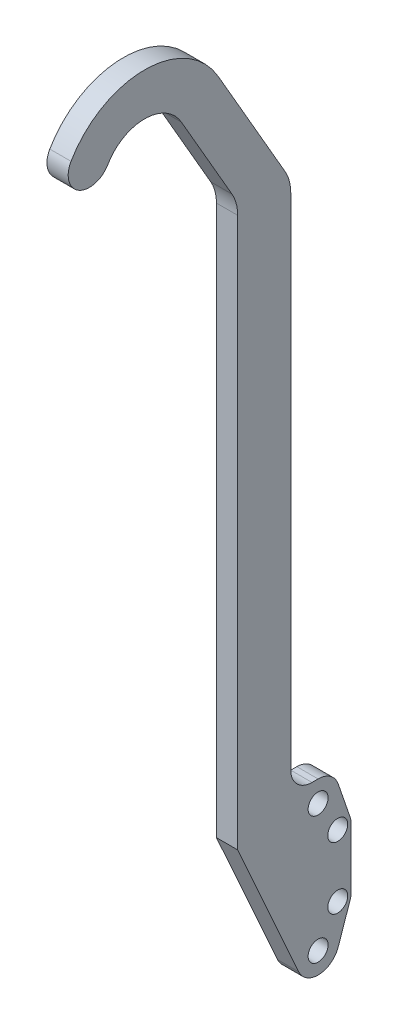
ISO-10303-21;
HEADER;
FILE_DESCRIPTION(('STEP AP214'),'2;1');
FILE_NAME('part.step','',(''),(''),'','','');
FILE_SCHEMA(('AUTOMOTIVE_DESIGN { 1 0 10303 214 1 1 1 1 }'));
ENDSEC;
DATA;
#1=APPLICATION_CONTEXT('core data for automotive mechanical design processes');
#2=APPLICATION_PROTOCOL_DEFINITION('international standard','automotive_design',2000,#1);
#3=PRODUCT_CONTEXT('',#1,'mechanical');
#4=PRODUCT('Part','Part','',(#3));
#5=PRODUCT_RELATED_PRODUCT_CATEGORY('part','',(#4));
#6=PRODUCT_DEFINITION_FORMATION('','',#4);
#7=PRODUCT_DEFINITION_CONTEXT('part definition',#1,'design');
#8=PRODUCT_DEFINITION('design','',#6,#7);
#9=PRODUCT_DEFINITION_SHAPE('','',#8);
#10=(LENGTH_UNIT() NAMED_UNIT(*) SI_UNIT(.MILLI.,.METRE.));
#11=(NAMED_UNIT(*) PLANE_ANGLE_UNIT() SI_UNIT($,.RADIAN.));
#12=(NAMED_UNIT(*) SI_UNIT($,.STERADIAN.) SOLID_ANGLE_UNIT());
#13=UNCERTAINTY_MEASURE_WITH_UNIT(LENGTH_MEASURE(1.E-05),#10,'distance_accuracy_value','');
#14=(GEOMETRIC_REPRESENTATION_CONTEXT(3) GLOBAL_UNCERTAINTY_ASSIGNED_CONTEXT((#13)) GLOBAL_UNIT_ASSIGNED_CONTEXT((#10,
#11,#12)) REPRESENTATION_CONTEXT('',''));
#15=CARTESIAN_POINT('',(0.,0.,0.));
#16=DIRECTION('',(0.,0.,1.));
#17=DIRECTION('',(1.,0.,0.));
#18=AXIS2_PLACEMENT_3D('',#15,#16,#17);
#19=CARTESIAN_POINT('',(3.175,19.05,26.9875));
#20=DIRECTION('',(0.,0.,-1.));
#21=DIRECTION('',(-1.,0.,0.));
#22=AXIS2_PLACEMENT_3D('',#19,#20,#21);
#23=PLANE('',#22);
#24=DIRECTION('',(0.,-1.,0.));
#25=VECTOR('',#24,1.);
#26=CARTESIAN_POINT('',(3.175,19.05,26.9875));
#27=LINE('',#26,#25);
#28=CARTESIAN_POINT('',(3.175,183.35625,26.9875));
#29=VERTEX_POINT('',#28);
#30=CARTESIAN_POINT('',(3.175,19.05,26.9875));
#31=VERTEX_POINT('',#30);
#32=EDGE_CURVE('E169',#29,#31,#27,.T.);
#33=ORIENTED_EDGE('',*,*,#32,.F.);
#34=DIRECTION('',(-1.,0.,0.));
#35=VECTOR('',#34,1.);
#36=CARTESIAN_POINT('',(-3.175,183.35625,26.9875));
#37=LINE('',#36,#35);
#38=CARTESIAN_POINT('',(-3.175,183.35625,26.9875));
#39=VERTEX_POINT('',#38);
#40=EDGE_CURVE('E211',#29,#39,#37,.T.);
#41=ORIENTED_EDGE('',*,*,#40,.T.);
#42=DIRECTION('',(0.,-1.,0.));
#43=VECTOR('',#42,1.);
#44=CARTESIAN_POINT('',(-3.175,19.05,26.9875));
#45=LINE('',#44,#43);
#46=CARTESIAN_POINT('',(-3.175,19.05,26.9875));
#47=VERTEX_POINT('',#46);
#48=EDGE_CURVE('E193',#39,#47,#45,.T.);
#49=ORIENTED_EDGE('',*,*,#48,.T.);
#50=DIRECTION('',(-1.,0.,0.));
#51=VECTOR('',#50,1.);
#52=CARTESIAN_POINT('',(3.175,19.05,26.9875));
#53=LINE('',#52,#51);
#54=EDGE_CURVE('E186',#31,#47,#53,.T.);
#55=ORIENTED_EDGE('',*,*,#54,.F.);
#56=EDGE_LOOP('',(#33,#41,#49,#55));
#57=FACE_BOUND('',#56,.T.);
#58=ADVANCED_FACE('F39',(#57),#23,.F.);
#59=CARTESIAN_POINT('',(3.175,-21.6489103967346,8.73130399649012));
#60=DIRECTION('',(0.,0.409277227832218,-0.91241007818742));
#61=DIRECTION('',(0.,0.912410078187421,0.409277227832218));
#62=AXIS2_PLACEMENT_3D('',#59,#60,#61);
#63=PLANE('',#62);
#64=DIRECTION('',(0.,-0.912410078187421,-0.409277227832218));
#65=VECTOR('',#64,1.);
#66=CARTESIAN_POINT('',(-3.175,-21.6489103967346,8.73130399649012));
#67=LINE('',#66,#65);
#68=CARTESIAN_POINT('',(-3.175,-21.6489103967346,8.73130399649012));
#69=VERTEX_POINT('',#68);
#70=EDGE_CURVE('E296',#47,#69,#67,.T.);
#71=ORIENTED_EDGE('',*,*,#70,.T.);
#72=DIRECTION('',(-1.,0.,0.));
#73=VECTOR('',#72,1.);
#74=CARTESIAN_POINT('',(3.175,-21.6489103967346,8.73130399649012));
#75=LINE('',#74,#73);
#76=CARTESIAN_POINT('',(3.175,-21.6489103967346,8.73130399649012));
#77=VERTEX_POINT('',#76);
#78=EDGE_CURVE('E188',#77,#69,#75,.T.);
#79=ORIENTED_EDGE('',*,*,#78,.F.);
#80=DIRECTION('',(0.,-0.912410078187421,-0.409277227832218));
#81=VECTOR('',#80,1.);
#82=CARTESIAN_POINT('',(3.175,-21.6489103967346,8.73130399649012));
#83=LINE('',#82,#81);
#84=EDGE_CURVE('E172',#31,#77,#83,.T.);
#85=ORIENTED_EDGE('',*,*,#84,.F.);
#86=ORIENTED_EDGE('',*,*,#54,.T.);
#87=EDGE_LOOP('',(#71,#79,#85,#86));
#88=FACE_BOUND('',#87,.T.);
#89=ADVANCED_FACE('F185',(#88),#63,.F.);
#90=CARTESIAN_POINT('',(3.175,-19.05,2.9375));
#91=DIRECTION('',(-1.,0.,0.));
#92=DIRECTION('',(0.,0.,1.));
#93=AXIS2_PLACEMENT_3D('',#90,#91,#92);
#94=CYLINDRICAL_SURFACE('',#93,6.35);
#95=CARTESIAN_POINT('',(-3.175,-19.05,2.9375));
#96=DIRECTION('',(1.,0.,0.));
#97=DIRECTION('',(0.,0.,-1.));
#98=AXIS2_PLACEMENT_3D('',#95,#96,#97);
#99=CIRCLE('',#98,6.35);
#100=CARTESIAN_POINT('',(-3.175,-21.1127612825467,-3.06812368877923));
#101=VERTEX_POINT('',#100);
#102=EDGE_CURVE('E290',#69,#101,#99,.T.);
#103=ORIENTED_EDGE('',*,*,#102,.T.);
#104=DIRECTION('',(-1.,0.,0.));
#105=VECTOR('',#104,1.);
#106=CARTESIAN_POINT('',(3.175,-21.1127612825467,-3.06812368877923));
#107=LINE('',#106,#105);
#108=CARTESIAN_POINT('',(3.175,-21.1127612825467,-3.06812368877923));
#109=VERTEX_POINT('',#108);
#110=EDGE_CURVE('E200',#109,#101,#107,.T.);
#111=ORIENTED_EDGE('',*,*,#110,.F.);
#112=CARTESIAN_POINT('',(3.175,-19.05,2.9375));
#113=DIRECTION('',(1.,0.,0.));
#114=DIRECTION('',(0.,0.,-1.));
#115=AXIS2_PLACEMENT_3D('',#112,#113,#114);
#116=CIRCLE('',#115,6.35);
#117=EDGE_CURVE('E190',#77,#109,#116,.T.);
#118=ORIENTED_EDGE('',*,*,#117,.F.);
#119=ORIENTED_EDGE('',*,*,#78,.T.);
#120=EDGE_LOOP('',(#103,#111,#118,#119));
#121=FACE_BOUND('',#120,.T.);
#122=ADVANCED_FACE('F330',(#121),#94,.T.);
#123=CARTESIAN_POINT('',(3.175,-21.1127612825467,-3.06812368877924));
#124=DIRECTION('',(0.,0.324844296464046,0.945767510043974));
#125=DIRECTION('',(0.,-0.945767510043974,0.324844296464046));
#126=AXIS2_PLACEMENT_3D('',#123,#124,#125);
#127=PLANE('',#126);
#128=DIRECTION('',(0.,0.945767510043974,-0.324844296464046));
#129=VECTOR('',#128,1.);
#130=CARTESIAN_POINT('',(-3.175,-21.1127612825467,-3.06812368877924));
#131=LINE('',#130,#129);
#132=CARTESIAN_POINT('',(-3.175,-10.564899590327,-6.69101480548702));
#133=VERTEX_POINT('',#132);
#134=EDGE_CURVE('E285',#101,#133,#131,.T.);
#135=ORIENTED_EDGE('',*,*,#134,.T.);
#136=DIRECTION('',(-1.,0.,0.));
#137=VECTOR('',#136,1.);
#138=CARTESIAN_POINT('',(3.175,-10.564899590327,-6.69101480548702));
#139=LINE('',#138,#137);
#140=CARTESIAN_POINT('',(3.175,-10.564899590327,-6.69101480548702));
#141=VERTEX_POINT('',#140);
#142=EDGE_CURVE('E276',#141,#133,#139,.T.);
#143=ORIENTED_EDGE('',*,*,#142,.F.);
#144=DIRECTION('',(0.,0.945767510043974,-0.324844296464046));
#145=VECTOR('',#144,1.);
#146=CARTESIAN_POINT('',(3.175,-21.1127612825467,-3.06812368877924));
#147=LINE('',#146,#145);
#148=EDGE_CURVE('E286',#109,#141,#147,.T.);
#149=ORIENTED_EDGE('',*,*,#148,.F.);
#150=ORIENTED_EDGE('',*,*,#110,.T.);
#151=EDGE_LOOP('',(#135,#143,#149,#150));
#152=FACE_BOUND('',#151,.T.);
#153=ADVANCED_FACE('F283',(#152),#127,.F.);
#154=CARTESIAN_POINT('',(3.175,-9.27567378873536,-2.9375));
#155=DIRECTION('',(-1.,0.,0.));
#156=DIRECTION('',(0.,0.,1.));
#157=AXIS2_PLACEMENT_3D('',#154,#155,#156);
#158=CYLINDRICAL_SURFACE('',#157,3.96875);
#159=CARTESIAN_POINT('',(-3.175,-9.27567378873536,-2.9375));
#160=DIRECTION('',(1.,0.,0.));
#161=DIRECTION('',(0.,0.,-1.));
#162=AXIS2_PLACEMENT_3D('',#159,#160,#161);
#163=CIRCLE('',#162,3.96875);
#164=CARTESIAN_POINT('',(-3.175,-9.27567378873536,-6.90625));
#165=VERTEX_POINT('',#164);
#166=EDGE_CURVE('E292',#133,#165,#163,.T.);
#167=ORIENTED_EDGE('',*,*,#166,.T.);
#168=DIRECTION('',(-1.,0.,0.));
#169=VECTOR('',#168,1.);
#170=CARTESIAN_POINT('',(3.175,-9.27567378873536,-6.90625));
#171=LINE('',#170,#169);
#172=CARTESIAN_POINT('',(3.175,-9.27567378873536,-6.90625));
#173=VERTEX_POINT('',#172);
#174=EDGE_CURVE('E273',#173,#165,#171,.T.);
#175=ORIENTED_EDGE('',*,*,#174,.F.);
#176=CARTESIAN_POINT('',(3.175,-9.27567378873536,-2.9375));
#177=DIRECTION('',(1.,0.,0.));
#178=DIRECTION('',(0.,0.,-1.));
#179=AXIS2_PLACEMENT_3D('',#176,#177,#178);
#180=CIRCLE('',#179,3.96875);
#181=EDGE_CURVE('E332',#141,#173,#180,.T.);
#182=ORIENTED_EDGE('',*,*,#181,.F.);
#183=ORIENTED_EDGE('',*,*,#142,.T.);
#184=EDGE_LOOP('',(#167,#175,#182,#183));
#185=FACE_BOUND('',#184,.T.);
#186=ADVANCED_FACE('F354',(#185),#158,.T.);
#187=CARTESIAN_POINT('',(3.175,9.27567378873536,-6.90625));
#188=DIRECTION('',(0.,0.,1.));
#189=DIRECTION('',(1.,0.,0.));
#190=AXIS2_PLACEMENT_3D('',#187,#188,#189);
#191=PLANE('',#190);
#192=DIRECTION('',(0.,1.,0.));
#193=VECTOR('',#192,1.);
#194=CARTESIAN_POINT('',(-3.175,9.27567378873536,-6.90625));
#195=LINE('',#194,#193);
#196=CARTESIAN_POINT('',(-3.175,9.27567378873536,-6.90625));
#197=VERTEX_POINT('',#196);
#198=EDGE_CURVE('E294',#165,#197,#195,.T.);
#199=ORIENTED_EDGE('',*,*,#198,.T.);
#200=DIRECTION('',(-1.,0.,0.));
#201=VECTOR('',#200,1.);
#202=CARTESIAN_POINT('',(3.175,9.27567378873536,-6.90625));
#203=LINE('',#202,#201);
#204=CARTESIAN_POINT('',(3.175,9.27567378873536,-6.90625));
#205=VERTEX_POINT('',#204);
#206=EDGE_CURVE('E270',#205,#197,#203,.T.);
#207=ORIENTED_EDGE('',*,*,#206,.F.);
#208=DIRECTION('',(0.,1.,0.));
#209=VECTOR('',#208,1.);
#210=CARTESIAN_POINT('',(3.175,9.27567378873536,-6.90625));
#211=LINE('',#210,#209);
#212=EDGE_CURVE('E336',#173,#205,#211,.T.);
#213=ORIENTED_EDGE('',*,*,#212,.F.);
#214=ORIENTED_EDGE('',*,*,#174,.T.);
#215=EDGE_LOOP('',(#199,#207,#213,#214));
#216=FACE_BOUND('',#215,.T.);
#217=ADVANCED_FACE('F350',(#216),#191,.F.);
#218=CARTESIAN_POINT('',(3.175,9.27567378873536,-2.9375));
#219=DIRECTION('',(-1.,0.,0.));
#220=DIRECTION('',(0.,0.,1.));
#221=AXIS2_PLACEMENT_3D('',#218,#219,#220);
#222=CYLINDRICAL_SURFACE('',#221,3.96875);
#223=CARTESIAN_POINT('',(-3.175,9.27567378873536,-2.9375));
#224=DIRECTION('',(1.,0.,0.));
#225=DIRECTION('',(0.,0.,1.));
#226=AXIS2_PLACEMENT_3D('',#223,#224,#225);
#227=CIRCLE('',#226,3.96875);
#228=CARTESIAN_POINT('',(-3.175,10.564899590327,-6.69101480548702));
#229=VERTEX_POINT('',#228);
#230=EDGE_CURVE('E301',#197,#229,#227,.T.);
#231=ORIENTED_EDGE('',*,*,#230,.T.);
#232=DIRECTION('',(-1.,0.,0.));
#233=VECTOR('',#232,1.);
#234=CARTESIAN_POINT('',(3.175,10.564899590327,-6.69101480548702));
#235=LINE('',#234,#233);
#236=CARTESIAN_POINT('',(3.175,10.564899590327,-6.69101480548702));
#237=VERTEX_POINT('',#236);
#238=EDGE_CURVE('E267',#237,#229,#235,.T.);
#239=ORIENTED_EDGE('',*,*,#238,.F.);
#240=CARTESIAN_POINT('',(3.175,9.27567378873536,-2.9375));
#241=DIRECTION('',(1.,0.,0.));
#242=DIRECTION('',(0.,0.,1.));
#243=AXIS2_PLACEMENT_3D('',#240,#241,#242);
#244=CIRCLE('',#243,3.96875);
#245=EDGE_CURVE('E338',#205,#237,#244,.T.);
#246=ORIENTED_EDGE('',*,*,#245,.F.);
#247=ORIENTED_EDGE('',*,*,#206,.T.);
#248=EDGE_LOOP('',(#231,#239,#246,#247));
#249=FACE_BOUND('',#248,.T.);
#250=ADVANCED_FACE('F346',(#249),#222,.T.);
#251=CARTESIAN_POINT('',(3.175,21.1127612825467,-3.06812368877924));
#252=DIRECTION('',(0.,-0.324844296464046,0.945767510043974));
#253=DIRECTION('',(0.,-0.945767510043974,-0.324844296464046));
#254=AXIS2_PLACEMENT_3D('',#251,#252,#253);
#255=PLANE('',#254);
#256=DIRECTION('',(0.,0.945767510043974,0.324844296464046));
#257=VECTOR('',#256,1.);
#258=CARTESIAN_POINT('',(-3.175,21.1127612825467,-3.06812368877924));
#259=LINE('',#258,#257);
#260=CARTESIAN_POINT('',(-3.175,21.1127612825467,-3.06812368877924));
#261=VERTEX_POINT('',#260);
#262=EDGE_CURVE('E303',#229,#261,#259,.T.);
#263=ORIENTED_EDGE('',*,*,#262,.T.);
#264=DIRECTION('',(-1.,0.,0.));
#265=VECTOR('',#264,1.);
#266=CARTESIAN_POINT('',(3.175,21.1127612825467,-3.06812368877924));
#267=LINE('',#266,#265);
#268=CARTESIAN_POINT('',(3.175,21.1127612825467,-3.06812368877924));
#269=VERTEX_POINT('',#268);
#270=EDGE_CURVE('E264',#269,#261,#267,.T.);
#271=ORIENTED_EDGE('',*,*,#270,.F.);
#272=DIRECTION('',(0.,0.945767510043974,0.324844296464046));
#273=VECTOR('',#272,1.);
#274=CARTESIAN_POINT('',(3.175,21.1127612825467,-3.06812368877924));
#275=LINE('',#274,#273);
#276=EDGE_CURVE('E317',#237,#269,#275,.T.);
#277=ORIENTED_EDGE('',*,*,#276,.F.);
#278=ORIENTED_EDGE('',*,*,#238,.T.);
#279=EDGE_LOOP('',(#263,#271,#277,#278));
#280=FACE_BOUND('',#279,.T.);
#281=ADVANCED_FACE('F343',(#280),#255,.F.);
#282=CARTESIAN_POINT('',(3.175,19.05,2.9375));
#283=DIRECTION('',(-1.,0.,0.));
#284=DIRECTION('',(0.,0.,1.));
#285=AXIS2_PLACEMENT_3D('',#282,#283,#284);
#286=CYLINDRICAL_SURFACE('',#285,6.35);
#287=CARTESIAN_POINT('',(-3.175,19.05,2.9375));
#288=DIRECTION('',(1.,0.,0.));
#289=DIRECTION('',(0.,0.,-1.));
#290=AXIS2_PLACEMENT_3D('',#287,#288,#289);
#291=CIRCLE('',#290,6.35);
#292=CARTESIAN_POINT('',(-3.175,25.4,2.9375));
#293=VERTEX_POINT('',#292);
#294=EDGE_CURVE('E237',#261,#293,#291,.T.);
#295=ORIENTED_EDGE('',*,*,#294,.T.);
#296=DIRECTION('',(-1.,0.,0.));
#297=VECTOR('',#296,1.);
#298=CARTESIAN_POINT('',(3.175,25.4,2.9375));
#299=LINE('',#298,#297);
#300=CARTESIAN_POINT('',(3.175,25.4,2.9375));
#301=VERTEX_POINT('',#300);
#302=EDGE_CURVE('E261',#301,#293,#299,.T.);
#303=ORIENTED_EDGE('',*,*,#302,.F.);
#304=CARTESIAN_POINT('',(3.175,19.05,2.9375));
#305=DIRECTION('',(1.,0.,0.));
#306=DIRECTION('',(0.,0.,-1.));
#307=AXIS2_PLACEMENT_3D('',#304,#305,#306);
#308=CIRCLE('',#307,6.35);
#309=EDGE_CURVE('E313',#269,#301,#308,.T.);
#310=ORIENTED_EDGE('',*,*,#309,.F.);
#311=ORIENTED_EDGE('',*,*,#270,.T.);
#312=EDGE_LOOP('',(#295,#303,#310,#311));
#313=FACE_BOUND('',#312,.T.);
#314=ADVANCED_FACE('F307',(#313),#286,.T.);
#315=CARTESIAN_POINT('',(3.175,25.4,2.9375));
#316=DIRECTION('',(0.,-1.,0.));
#317=DIRECTION('',(0.,0.,-1.));
#318=AXIS2_PLACEMENT_3D('',#315,#316,#317);
#319=PLANE('',#318);
#320=DIRECTION('',(0.,0.,1.));
#321=VECTOR('',#320,1.);
#322=CARTESIAN_POINT('',(-3.175,25.4,2.9375));
#323=LINE('',#322,#321);
#324=CARTESIAN_POINT('',(-3.175,25.4,4.76250000000002));
#325=VERTEX_POINT('',#324);
#326=EDGE_CURVE('E233',#293,#325,#323,.T.);
#327=ORIENTED_EDGE('',*,*,#326,.T.);
#328=DIRECTION('',(-1.,0.,0.));
#329=VECTOR('',#328,1.);
#330=CARTESIAN_POINT('',(3.175,25.4,4.76250000000002));
#331=LINE('',#330,#329);
#332=CARTESIAN_POINT('',(3.175,25.4,4.76250000000002));
#333=VERTEX_POINT('',#332);
#334=EDGE_CURVE('E54',#325,#333,#331,.F.);
#335=ORIENTED_EDGE('',*,*,#334,.T.);
#336=DIRECTION('',(0.,0.,1.));
#337=VECTOR('',#336,1.);
#338=CARTESIAN_POINT('',(3.175,25.4,2.9375));
#339=LINE('',#338,#337);
#340=EDGE_CURVE('E312',#301,#333,#339,.T.);
#341=ORIENTED_EDGE('',*,*,#340,.F.);
#342=ORIENTED_EDGE('',*,*,#302,.T.);
#343=EDGE_LOOP('',(#327,#335,#341,#342));
#344=FACE_BOUND('',#343,.T.);
#345=ADVANCED_FACE('F311',(#344),#319,.F.);
#346=CARTESIAN_POINT('',(3.175,184.66289817372,11.1125));
#347=DIRECTION('',(0.,0.,1.));
#348=DIRECTION('',(0.,-1.,0.));
#349=AXIS2_PLACEMENT_3D('',#346,#347,#348);
#350=PLANE('',#349);
#351=DIRECTION('',(0.,1.,0.));
#352=VECTOR('',#351,1.);
#353=CARTESIAN_POINT('',(3.175,184.66289817372,11.1125));
#354=LINE('',#353,#352);
#355=CARTESIAN_POINT('',(3.175,31.75,11.1125));
#356=VERTEX_POINT('',#355);
#357=CARTESIAN_POINT('',(3.175,181.259943429844,11.1125));
#358=VERTEX_POINT('',#357);
#359=EDGE_CURVE('E226',#356,#358,#354,.T.);
#360=ORIENTED_EDGE('',*,*,#359,.F.);
#361=DIRECTION('',(-1.,0.,0.));
#362=VECTOR('',#361,1.);
#363=CARTESIAN_POINT('',(-3.175,31.75,11.1125));
#364=LINE('',#363,#362);
#365=CARTESIAN_POINT('',(-3.175,31.75,11.1125));
#366=VERTEX_POINT('',#365);
#367=EDGE_CURVE('E218',#356,#366,#364,.T.);
#368=ORIENTED_EDGE('',*,*,#367,.T.);
#369=DIRECTION('',(0.,1.,0.));
#370=VECTOR('',#369,1.);
#371=CARTESIAN_POINT('',(-3.175,184.66289817372,11.1125));
#372=LINE('',#371,#370);
#373=CARTESIAN_POINT('',(-3.175,181.259943429844,11.1125));
#374=VERTEX_POINT('',#373);
#375=EDGE_CURVE('E225',#366,#374,#372,.T.);
#376=ORIENTED_EDGE('',*,*,#375,.T.);
#377=DIRECTION('',(-1.,0.,0.));
#378=VECTOR('',#377,1.);
#379=CARTESIAN_POINT('',(3.175,181.259943429844,11.1125));
#380=LINE('',#379,#378);
#381=EDGE_CURVE('E206',#374,#358,#380,.F.);
#382=ORIENTED_EDGE('',*,*,#381,.T.);
#383=EDGE_LOOP('',(#360,#368,#376,#382));
#384=FACE_BOUND('',#383,.T.);
#385=ADVANCED_FACE('F224',(#384),#350,.F.);
#386=CARTESIAN_POINT('',(3.175,222.25,32.813423357461));
#387=DIRECTION('',(0.,-0.500000000000001,0.866025403784438));
#388=DIRECTION('',(0.,-0.866025403784438,-0.500000000000001));
#389=AXIS2_PLACEMENT_3D('',#386,#387,#388);
#390=PLANE('',#389);
#391=DIRECTION('',(0.,0.866025403784438,0.500000000000001));
#392=VECTOR('',#391,1.);
#393=CARTESIAN_POINT('',(3.175,222.25,32.813423357461));
#394=LINE('',#393,#392);
#395=CARTESIAN_POINT('',(3.175,187.609943429844,12.8139773719377));
#396=VERTEX_POINT('',#395);
#397=CARTESIAN_POINT('',(3.175,222.25,32.813423357461));
#398=VERTEX_POINT('',#397);
#399=EDGE_CURVE('E315',#396,#398,#394,.T.);
#400=ORIENTED_EDGE('',*,*,#399,.F.);
#401=DIRECTION('',(-1.,0.,0.));
#402=VECTOR('',#401,1.);
#403=CARTESIAN_POINT('',(3.175,187.609943429844,12.8139773719377));
#404=LINE('',#403,#402);
#405=CARTESIAN_POINT('',(-3.175,187.609943429844,12.8139773719377));
#406=VERTEX_POINT('',#405);
#407=EDGE_CURVE('E195',#396,#406,#404,.T.);
#408=ORIENTED_EDGE('',*,*,#407,.T.);
#409=DIRECTION('',(0.,0.866025403784438,0.500000000000001));
#410=VECTOR('',#409,1.);
#411=CARTESIAN_POINT('',(-3.175,222.25,32.813423357461));
#412=LINE('',#411,#410);
#413=CARTESIAN_POINT('',(-3.175,222.25,32.813423357461));
#414=VERTEX_POINT('',#413);
#415=EDGE_CURVE('E232',#406,#414,#412,.T.);
#416=ORIENTED_EDGE('',*,*,#415,.T.);
#417=DIRECTION('',(-1.,0.,0.));
#418=VECTOR('',#417,1.);
#419=CARTESIAN_POINT('',(3.175,222.25,32.813423357461));
#420=LINE('',#419,#418);
#421=EDGE_CURVE('E258',#398,#414,#420,.T.);
#422=ORIENTED_EDGE('',*,*,#421,.F.);
#423=EDGE_LOOP('',(#400,#408,#416,#422));
#424=FACE_BOUND('',#423,.T.);
#425=ADVANCED_FACE('F409',(#424),#390,.F.);
#426=CARTESIAN_POINT('',(3.175,209.55,54.8104686135857));
#427=DIRECTION('',(-1.,0.,0.));
#428=DIRECTION('',(0.,0.,1.));
#429=AXIS2_PLACEMENT_3D('',#426,#427,#428);
#430=CYLINDRICAL_SURFACE('',#429,25.4);
#431=CARTESIAN_POINT('',(-3.175,209.55,54.8104686135857));
#432=DIRECTION('',(1.,0.,0.));
#433=DIRECTION('',(0.,0.,1.));
#434=AXIS2_PLACEMENT_3D('',#431,#432,#433);
#435=CIRCLE('',#434,25.4);
#436=CARTESIAN_POINT('',(-3.175,222.25,76.8075138697105));
#437=VERTEX_POINT('',#436);
#438=EDGE_CURVE('E235',#414,#437,#435,.T.);
#439=ORIENTED_EDGE('',*,*,#438,.T.);
#440=DIRECTION('',(-1.,0.,0.));
#441=VECTOR('',#440,1.);
#442=CARTESIAN_POINT('',(3.175,222.25,76.8075138697105));
#443=LINE('',#442,#441);
#444=CARTESIAN_POINT('',(3.175,222.25,76.8075138697105));
#445=VERTEX_POINT('',#444);
#446=EDGE_CURVE('E255',#445,#437,#443,.T.);
#447=ORIENTED_EDGE('',*,*,#446,.F.);
#448=CARTESIAN_POINT('',(3.175,209.55,54.8104686135857));
#449=DIRECTION('',(1.,0.,0.));
#450=DIRECTION('',(0.,0.,1.));
#451=AXIS2_PLACEMENT_3D('',#448,#449,#450);
#452=CIRCLE('',#451,25.4);
#453=EDGE_CURVE('E322',#398,#445,#452,.T.);
#454=ORIENTED_EDGE('',*,*,#453,.F.);
#455=ORIENTED_EDGE('',*,*,#421,.T.);
#456=EDGE_LOOP('',(#439,#447,#454,#455));
#457=FACE_BOUND('',#456,.T.);
#458=ADVANCED_FACE('F405',(#457),#430,.T.);
#459=CARTESIAN_POINT('',(3.175,219.075,71.3082525556793));
#460=DIRECTION('',(-1.,0.,0.));
#461=DIRECTION('',(0.,0.,1.));
#462=AXIS2_PLACEMENT_3D('',#459,#460,#461);
#463=CYLINDRICAL_SURFACE('',#462,6.34999999999999);
#464=CARTESIAN_POINT('',(-3.175,219.075,71.3082525556793));
#465=DIRECTION('',(1.,0.,0.));
#466=DIRECTION('',(0.,0.,1.));
#467=AXIS2_PLACEMENT_3D('',#464,#465,#466);
#468=CIRCLE('',#467,6.34999999999999);
#469=CARTESIAN_POINT('',(-3.175,215.9,65.8089912416481));
#470=VERTEX_POINT('',#469);
#471=EDGE_CURVE('E242',#437,#470,#468,.T.);
#472=ORIENTED_EDGE('',*,*,#471,.T.);
#473=DIRECTION('',(-1.,0.,0.));
#474=VECTOR('',#473,1.);
#475=CARTESIAN_POINT('',(3.175,215.9,65.8089912416481));
#476=LINE('',#475,#474);
#477=CARTESIAN_POINT('',(3.175,215.9,65.8089912416481));
#478=VERTEX_POINT('',#477);
#479=EDGE_CURVE('E251',#478,#470,#476,.T.);
#480=ORIENTED_EDGE('',*,*,#479,.F.);
#481=CARTESIAN_POINT('',(3.175,219.075,71.3082525556793));
#482=DIRECTION('',(1.,0.,0.));
#483=DIRECTION('',(0.,0.,1.));
#484=AXIS2_PLACEMENT_3D('',#481,#482,#483);
#485=CIRCLE('',#484,6.34999999999999);
#486=EDGE_CURVE('E324',#445,#478,#485,.T.);
#487=ORIENTED_EDGE('',*,*,#486,.F.);
#488=ORIENTED_EDGE('',*,*,#446,.T.);
#489=EDGE_LOOP('',(#472,#480,#487,#488));
#490=FACE_BOUND('',#489,.T.);
#491=ADVANCED_FACE('F400',(#490),#463,.T.);
#492=CARTESIAN_POINT('',(3.175,209.55,54.8104686135857));
#493=DIRECTION('',(-1.,0.,0.));
#494=DIRECTION('',(0.,0.,1.));
#495=AXIS2_PLACEMENT_3D('',#492,#493,#494);
#496=CYLINDRICAL_SURFACE('',#495,12.7);
#497=CARTESIAN_POINT('',(-3.175,209.55,54.8104686135857));
#498=DIRECTION('',(-1.,0.,0.));
#499=DIRECTION('',(0.,0.,-1.));
#500=AXIS2_PLACEMENT_3D('',#497,#498,#499);
#501=CIRCLE('',#500,12.7);
#502=CARTESIAN_POINT('',(-3.175,215.9,43.8119459855233));
#503=VERTEX_POINT('',#502);
#504=EDGE_CURVE('E244',#470,#503,#501,.T.);
#505=ORIENTED_EDGE('',*,*,#504,.T.);
#506=DIRECTION('',(-1.,0.,0.));
#507=VECTOR('',#506,1.);
#508=CARTESIAN_POINT('',(3.175,215.9,43.8119459855233));
#509=LINE('',#508,#507);
#510=CARTESIAN_POINT('',(3.175,215.9,43.8119459855233));
#511=VERTEX_POINT('',#510);
#512=EDGE_CURVE('E248',#511,#503,#509,.T.);
#513=ORIENTED_EDGE('',*,*,#512,.F.);
#514=CARTESIAN_POINT('',(3.175,209.55,54.8104686135857));
#515=DIRECTION('',(-1.,0.,0.));
#516=DIRECTION('',(0.,0.,-1.));
#517=AXIS2_PLACEMENT_3D('',#514,#515,#516);
#518=CIRCLE('',#517,12.7);
#519=EDGE_CURVE('E326',#478,#511,#518,.T.);
#520=ORIENTED_EDGE('',*,*,#519,.F.);
#521=ORIENTED_EDGE('',*,*,#479,.T.);
#522=EDGE_LOOP('',(#505,#513,#520,#521));
#523=FACE_BOUND('',#522,.T.);
#524=ADVANCED_FACE('F395',(#523),#496,.F.);
#525=CARTESIAN_POINT('',(3.175,186.759204743876,26.9875));
#526=DIRECTION('',(0.,0.500000000000001,-0.866025403784438));
#527=DIRECTION('',(0.,0.866025403784438,0.500000000000001));
#528=AXIS2_PLACEMENT_3D('',#525,#526,#527);
#529=PLANE('',#528);
#530=DIRECTION('',(0.,-0.866025403784438,-0.500000000000001));
#531=VECTOR('',#530,1.);
#532=CARTESIAN_POINT('',(-3.175,186.759204743876,26.9875));
#533=LINE('',#532,#531);
#534=CARTESIAN_POINT('',(-3.175,189.70625,28.6889773719377));
#535=VERTEX_POINT('',#534);
#536=EDGE_CURVE('E181',#503,#535,#533,.T.);
#537=ORIENTED_EDGE('',*,*,#536,.T.);
#538=DIRECTION('',(-1.,0.,0.));
#539=VECTOR('',#538,1.);
#540=CARTESIAN_POINT('',(3.175,189.70625,28.6889773719377));
#541=LINE('',#540,#539);
#542=CARTESIAN_POINT('',(3.175,189.70625,28.6889773719377));
#543=VERTEX_POINT('',#542);
#544=EDGE_CURVE('E213',#535,#543,#541,.F.);
#545=ORIENTED_EDGE('',*,*,#544,.T.);
#546=DIRECTION('',(0.,-0.866025403784438,-0.500000000000001));
#547=VECTOR('',#546,1.);
#548=CARTESIAN_POINT('',(3.175,186.759204743876,26.9875));
#549=LINE('',#548,#547);
#550=EDGE_CURVE('E252',#511,#543,#549,.T.);
#551=ORIENTED_EDGE('',*,*,#550,.F.);
#552=ORIENTED_EDGE('',*,*,#512,.T.);
#553=EDGE_LOOP('',(#537,#545,#551,#552));
#554=FACE_BOUND('',#553,.T.);
#555=ADVANCED_FACE('F390',(#554),#529,.F.);
#556=CARTESIAN_POINT('',(3.175,209.55,54.8104686135857));
#557=DIRECTION('',(1.,0.,0.));
#558=DIRECTION('',(0.,0.,-1.));
#559=AXIS2_PLACEMENT_3D('',#556,#557,#558);
#560=PLANE('',#559);
#561=CARTESIAN_POINT('',(3.175,19.05,2.9375));
#562=DIRECTION('',(1.,0.,0.));
#563=DIRECTION('',(0.,0.,-1.));
#564=AXIS2_PLACEMENT_3D('',#561,#562,#563);
#565=CIRCLE('',#564,2.9845);
#566=CARTESIAN_POINT('',(3.175,19.05,-0.0469999999999997));
#567=VERTEX_POINT('',#566);
#568=EDGE_CURVE('E621',#567,#567,#565,.T.);
#569=ORIENTED_EDGE('',*,*,#568,.F.);
#570=EDGE_LOOP('',(#569));
#571=FACE_BOUND('',#570,.T.);
#572=CARTESIAN_POINT('',(3.175,-9.27567378873536,-2.9375));
#573=DIRECTION('',(1.,0.,0.));
#574=DIRECTION('',(0.,0.,-1.));
#575=AXIS2_PLACEMENT_3D('',#572,#573,#574);
#576=CIRCLE('',#575,2.9845);
#577=CARTESIAN_POINT('',(3.175,-9.27567378873536,-5.922));
#578=VERTEX_POINT('',#577);
#579=EDGE_CURVE('E618',#578,#578,#576,.T.);
#580=ORIENTED_EDGE('',*,*,#579,.F.);
#581=EDGE_LOOP('',(#580));
#582=FACE_BOUND('',#581,.T.);
#583=CARTESIAN_POINT('',(3.175,-19.05,2.9375));
#584=DIRECTION('',(1.,0.,0.));
#585=DIRECTION('',(0.,0.,-1.));
#586=AXIS2_PLACEMENT_3D('',#583,#584,#585);
#587=CIRCLE('',#586,2.9845);
#588=CARTESIAN_POINT('',(3.175,-19.05,-0.0469999999999997));
#589=VERTEX_POINT('',#588);
#590=EDGE_CURVE('E614',#589,#589,#587,.T.);
#591=ORIENTED_EDGE('',*,*,#590,.F.);
#592=EDGE_LOOP('',(#591));
#593=FACE_BOUND('',#592,.T.);
#594=CARTESIAN_POINT('',(3.175,9.27567378873536,-2.9375));
#595=DIRECTION('',(1.,0.,0.));
#596=DIRECTION('',(0.,0.,-1.));
#597=AXIS2_PLACEMENT_3D('',#594,#595,#596);
#598=CIRCLE('',#597,2.9845);
#599=CARTESIAN_POINT('',(3.175,9.27567378873536,-5.922));
#600=VERTEX_POINT('',#599);
#601=EDGE_CURVE('E608',#600,#600,#598,.T.);
#602=ORIENTED_EDGE('',*,*,#601,.F.);
#603=EDGE_LOOP('',(#602));
#604=FACE_BOUND('',#603,.T.);
#605=ORIENTED_EDGE('',*,*,#340,.T.);
#606=CARTESIAN_POINT('',(3.175,31.75,4.76250000000002));
#607=DIRECTION('',(1.,0.,0.));
#608=DIRECTION('',(0.,0.,-1.));
#609=AXIS2_PLACEMENT_3D('',#606,#607,#608);
#610=CIRCLE('',#609,6.35);
#611=EDGE_CURVE('E11',#333,#356,#610,.F.);
#612=ORIENTED_EDGE('',*,*,#611,.T.);
#613=ORIENTED_EDGE('',*,*,#359,.T.);
#614=CARTESIAN_POINT('',(3.175,181.259943429844,23.8125));
#615=DIRECTION('',(1.,0.,0.));
#616=DIRECTION('',(0.,0.,-1.));
#617=AXIS2_PLACEMENT_3D('',#614,#615,#616);
#618=CIRCLE('',#617,12.7);
#619=EDGE_CURVE('E209',#358,#396,#618,.T.);
#620=ORIENTED_EDGE('',*,*,#619,.T.);
#621=ORIENTED_EDGE('',*,*,#399,.T.);
#622=ORIENTED_EDGE('',*,*,#453,.T.);
#623=ORIENTED_EDGE('',*,*,#486,.T.);
#624=ORIENTED_EDGE('',*,*,#519,.T.);
#625=ORIENTED_EDGE('',*,*,#550,.T.);
#626=CARTESIAN_POINT('',(3.175,183.35625,39.6875));
#627=DIRECTION('',(1.,0.,0.));
#628=DIRECTION('',(0.,0.,-1.));
#629=AXIS2_PLACEMENT_3D('',#626,#627,#628);
#630=CIRCLE('',#629,12.7);
#631=EDGE_CURVE('E176',#543,#29,#630,.F.);
#632=ORIENTED_EDGE('',*,*,#631,.T.);
#633=ORIENTED_EDGE('',*,*,#32,.T.);
#634=ORIENTED_EDGE('',*,*,#84,.T.);
#635=ORIENTED_EDGE('',*,*,#117,.T.);
#636=ORIENTED_EDGE('',*,*,#148,.T.);
#637=ORIENTED_EDGE('',*,*,#181,.T.);
#638=ORIENTED_EDGE('',*,*,#212,.T.);
#639=ORIENTED_EDGE('',*,*,#245,.T.);
#640=ORIENTED_EDGE('',*,*,#276,.T.);
#641=ORIENTED_EDGE('',*,*,#309,.T.);
#642=EDGE_LOOP('',(#605,#612,#613,#620,#621,#622,#623,#624,#625,#632,#633,#634,#635,#636,#637,
#638,#639,#640,#641));
#643=FACE_BOUND('',#642,.T.);
#644=ADVANCED_FACE('F171',(#571,#582,#593,#604,#643),#560,.T.);
#645=CARTESIAN_POINT('',(-3.175,209.55,54.8104686135857));
#646=DIRECTION('',(1.,0.,0.));
#647=DIRECTION('',(0.,0.,-1.));
#648=AXIS2_PLACEMENT_3D('',#645,#646,#647);
#649=PLANE('',#648);
#650=CARTESIAN_POINT('',(-3.175,19.05,2.9375));
#651=DIRECTION('',(1.,0.,0.));
#652=DIRECTION('',(0.,0.,-1.));
#653=AXIS2_PLACEMENT_3D('',#650,#651,#652);
#654=CIRCLE('',#653,2.9845);
#655=CARTESIAN_POINT('',(-3.175,19.05,-0.0469999999999997));
#656=VERTEX_POINT('',#655);
#657=EDGE_CURVE('E329',#656,#656,#654,.T.);
#658=ORIENTED_EDGE('',*,*,#657,.T.);
#659=EDGE_LOOP('',(#658));
#660=FACE_BOUND('',#659,.T.);
#661=CARTESIAN_POINT('',(-3.175,-9.27567378873536,-2.9375));
#662=DIRECTION('',(1.,0.,0.));
#663=DIRECTION('',(0.,0.,-1.));
#664=AXIS2_PLACEMENT_3D('',#661,#662,#663);
#665=CIRCLE('',#664,2.9845);
#666=CARTESIAN_POINT('',(-3.175,-9.27567378873536,-5.922));
#667=VERTEX_POINT('',#666);
#668=EDGE_CURVE('E600',#667,#667,#665,.T.);
#669=ORIENTED_EDGE('',*,*,#668,.T.);
#670=EDGE_LOOP('',(#669));
#671=FACE_BOUND('',#670,.T.);
#672=CARTESIAN_POINT('',(-3.175,-19.05,2.9375));
#673=DIRECTION('',(1.,0.,0.));
#674=DIRECTION('',(0.,0.,-1.));
#675=AXIS2_PLACEMENT_3D('',#672,#673,#674);
#676=CIRCLE('',#675,2.9845);
#677=CARTESIAN_POINT('',(-3.175,-19.05,-0.0469999999999997));
#678=VERTEX_POINT('',#677);
#679=EDGE_CURVE('E604',#678,#678,#676,.T.);
#680=ORIENTED_EDGE('',*,*,#679,.T.);
#681=EDGE_LOOP('',(#680));
#682=FACE_BOUND('',#681,.T.);
#683=CARTESIAN_POINT('',(-3.175,9.27567378873536,-2.9375));
#684=DIRECTION('',(1.,0.,0.));
#685=DIRECTION('',(0.,0.,-1.));
#686=AXIS2_PLACEMENT_3D('',#683,#684,#685);
#687=CIRCLE('',#686,2.9845);
#688=CARTESIAN_POINT('',(-3.175,9.27567378873536,-5.922));
#689=VERTEX_POINT('',#688);
#690=EDGE_CURVE('E607',#689,#689,#687,.T.);
#691=ORIENTED_EDGE('',*,*,#690,.T.);
#692=EDGE_LOOP('',(#691));
#693=FACE_BOUND('',#692,.T.);
#694=ORIENTED_EDGE('',*,*,#415,.F.);
#695=CARTESIAN_POINT('',(-3.175,181.259943429844,23.8125));
#696=DIRECTION('',(1.,0.,0.));
#697=DIRECTION('',(0.,0.,-1.));
#698=AXIS2_PLACEMENT_3D('',#695,#696,#697);
#699=CIRCLE('',#698,12.7);
#700=EDGE_CURVE('E198',#406,#374,#699,.F.);
#701=ORIENTED_EDGE('',*,*,#700,.T.);
#702=ORIENTED_EDGE('',*,*,#375,.F.);
#703=CARTESIAN_POINT('',(-3.175,31.75,4.76250000000002));
#704=DIRECTION('',(1.,0.,0.));
#705=DIRECTION('',(0.,0.,-1.));
#706=AXIS2_PLACEMENT_3D('',#703,#704,#705);
#707=CIRCLE('',#706,6.35);
#708=EDGE_CURVE('E47',#366,#325,#707,.T.);
#709=ORIENTED_EDGE('',*,*,#708,.T.);
#710=ORIENTED_EDGE('',*,*,#326,.F.);
#711=ORIENTED_EDGE('',*,*,#294,.F.);
#712=ORIENTED_EDGE('',*,*,#262,.F.);
#713=ORIENTED_EDGE('',*,*,#230,.F.);
#714=ORIENTED_EDGE('',*,*,#198,.F.);
#715=ORIENTED_EDGE('',*,*,#166,.F.);
#716=ORIENTED_EDGE('',*,*,#134,.F.);
#717=ORIENTED_EDGE('',*,*,#102,.F.);
#718=ORIENTED_EDGE('',*,*,#70,.F.);
#719=ORIENTED_EDGE('',*,*,#48,.F.);
#720=CARTESIAN_POINT('',(-3.175,183.35625,39.6875));
#721=DIRECTION('',(1.,0.,0.));
#722=DIRECTION('',(0.,0.,-1.));
#723=AXIS2_PLACEMENT_3D('',#720,#721,#722);
#724=CIRCLE('',#723,12.7);
#725=EDGE_CURVE('E215',#39,#535,#724,.T.);
#726=ORIENTED_EDGE('',*,*,#725,.T.);
#727=ORIENTED_EDGE('',*,*,#536,.F.);
#728=ORIENTED_EDGE('',*,*,#504,.F.);
#729=ORIENTED_EDGE('',*,*,#471,.F.);
#730=ORIENTED_EDGE('',*,*,#438,.F.);
#731=EDGE_LOOP('',(#694,#701,#702,#709,#710,#711,#712,#713,#714,#715,#716,#717,#718,#719,#726,
#727,#728,#729,#730));
#732=FACE_BOUND('',#731,.T.);
#733=ADVANCED_FACE('F230',(#660,#671,#682,#693,#732),#649,.F.);
#734=CARTESIAN_POINT('',(3.175,181.259943429844,23.8125));
#735=DIRECTION('',(-1.,0.,0.));
#736=DIRECTION('',(0.,0.,1.));
#737=AXIS2_PLACEMENT_3D('',#734,#735,#736);
#738=CYLINDRICAL_SURFACE('',#737,12.7);
#739=ORIENTED_EDGE('',*,*,#619,.F.);
#740=ORIENTED_EDGE('',*,*,#381,.F.);
#741=ORIENTED_EDGE('',*,*,#700,.F.);
#742=ORIENTED_EDGE('',*,*,#407,.F.);
#743=EDGE_LOOP('',(#739,#740,#741,#742));
#744=FACE_BOUND('',#743,.T.);
#745=ADVANCED_FACE('F373',(#744),#738,.T.);
#746=CARTESIAN_POINT('',(3.175,183.35625,39.6875));
#747=DIRECTION('',(1.,0.,0.));
#748=DIRECTION('',(0.,0.,-1.));
#749=AXIS2_PLACEMENT_3D('',#746,#747,#748);
#750=CYLINDRICAL_SURFACE('',#749,12.7);
#751=ORIENTED_EDGE('',*,*,#631,.F.);
#752=ORIENTED_EDGE('',*,*,#544,.F.);
#753=ORIENTED_EDGE('',*,*,#725,.F.);
#754=ORIENTED_EDGE('',*,*,#40,.F.);
#755=EDGE_LOOP('',(#751,#752,#753,#754));
#756=FACE_BOUND('',#755,.T.);
#757=ADVANCED_FACE('F375',(#756),#750,.F.);
#758=CARTESIAN_POINT('',(-3.175,9.27567378873536,-2.9375));
#759=DIRECTION('',(1.,0.,0.));
#760=DIRECTION('',(0.,0.,-1.));
#761=AXIS2_PLACEMENT_3D('',#758,#759,#760);
#762=CYLINDRICAL_SURFACE('',#761,2.9845);
#763=ORIENTED_EDGE('',*,*,#690,.F.);
#764=EDGE_LOOP('',(#763));
#765=FACE_BOUND('',#764,.T.);
#766=ORIENTED_EDGE('',*,*,#601,.T.);
#767=EDGE_LOOP('',(#766));
#768=FACE_BOUND('',#767,.T.);
#769=ADVANCED_FACE('F378',(#765,#768),#762,.F.);
#770=CARTESIAN_POINT('',(-3.175,-19.05,2.9375));
#771=DIRECTION('',(1.,0.,0.));
#772=DIRECTION('',(0.,0.,-1.));
#773=AXIS2_PLACEMENT_3D('',#770,#771,#772);
#774=CYLINDRICAL_SURFACE('',#773,2.9845);
#775=ORIENTED_EDGE('',*,*,#679,.F.);
#776=EDGE_LOOP('',(#775));
#777=FACE_BOUND('',#776,.T.);
#778=ORIENTED_EDGE('',*,*,#590,.T.);
#779=EDGE_LOOP('',(#778));
#780=FACE_BOUND('',#779,.T.);
#781=ADVANCED_FACE('F383',(#777,#780),#774,.F.);
#782=CARTESIAN_POINT('',(-3.175,-9.27567378873536,-2.9375));
#783=DIRECTION('',(1.,0.,0.));
#784=DIRECTION('',(0.,0.,-1.));
#785=AXIS2_PLACEMENT_3D('',#782,#783,#784);
#786=CYLINDRICAL_SURFACE('',#785,2.9845);
#787=ORIENTED_EDGE('',*,*,#668,.F.);
#788=EDGE_LOOP('',(#787));
#789=FACE_BOUND('',#788,.T.);
#790=ORIENTED_EDGE('',*,*,#579,.T.);
#791=EDGE_LOOP('',(#790));
#792=FACE_BOUND('',#791,.T.);
#793=ADVANCED_FACE('F418',(#789,#792),#786,.F.);
#794=CARTESIAN_POINT('',(-3.175,19.05,2.9375));
#795=DIRECTION('',(1.,0.,0.));
#796=DIRECTION('',(0.,0.,-1.));
#797=AXIS2_PLACEMENT_3D('',#794,#795,#796);
#798=CYLINDRICAL_SURFACE('',#797,2.9845);
#799=ORIENTED_EDGE('',*,*,#657,.F.);
#800=EDGE_LOOP('',(#799));
#801=FACE_BOUND('',#800,.T.);
#802=ORIENTED_EDGE('',*,*,#568,.T.);
#803=EDGE_LOOP('',(#802));
#804=FACE_BOUND('',#803,.T.);
#805=ADVANCED_FACE('F413',(#801,#804),#798,.F.);
#806=CARTESIAN_POINT('',(3.175,31.75,4.76250000000002));
#807=DIRECTION('',(1.,0.,0.));
#808=DIRECTION('',(0.,0.,-1.));
#809=AXIS2_PLACEMENT_3D('',#806,#807,#808);
#810=CYLINDRICAL_SURFACE('',#809,6.35);
#811=ORIENTED_EDGE('',*,*,#611,.F.);
#812=ORIENTED_EDGE('',*,*,#334,.F.);
#813=ORIENTED_EDGE('',*,*,#708,.F.);
#814=ORIENTED_EDGE('',*,*,#367,.F.);
#815=EDGE_LOOP('',(#811,#812,#813,#814));
#816=FACE_BOUND('',#815,.T.);
#817=ADVANCED_FACE('F41',(#816),#810,.F.);
#818=CLOSED_SHELL('',(#58,#89,#122,#153,#186,#217,#250,#281,#314,#345,#385,#425,#458,#491,#524,
#555,#644,#733,#745,#757,#769,#781,#793,#805,#817));
#819=MANIFOLD_SOLID_BREP('B2',#818);
#820=ADVANCED_BREP_SHAPE_REPRESENTATION('',(#18,#819),#14);
#821=SHAPE_DEFINITION_REPRESENTATION(#9,#820);
ENDSEC;
END-ISO-10303-21;
